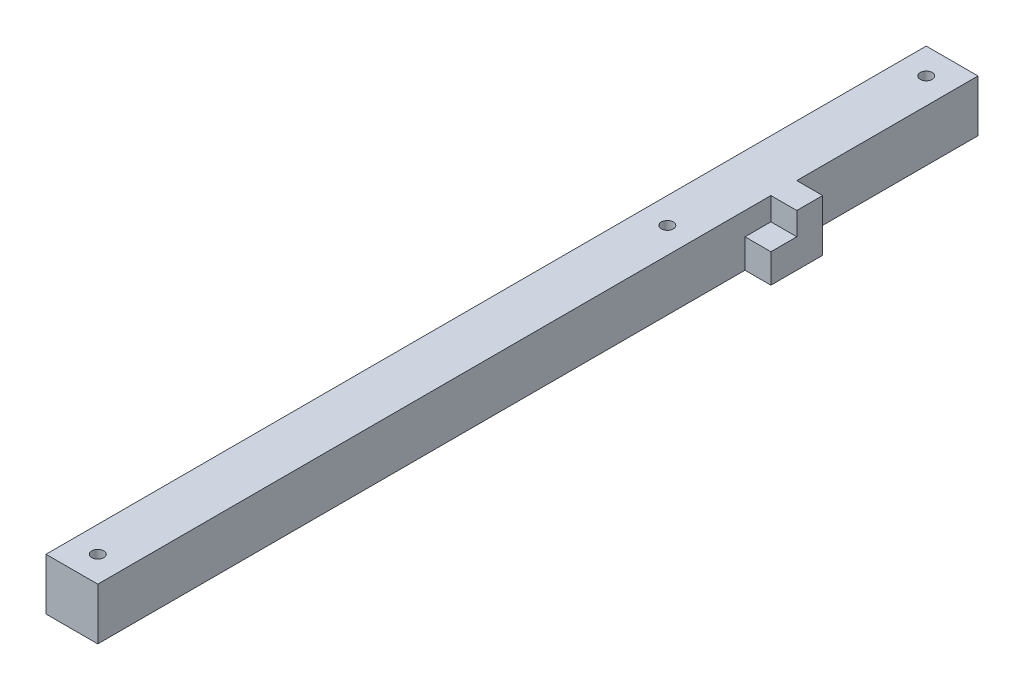
ISO-10303-21;
HEADER;
FILE_DESCRIPTION(('STEP AP214'),'2;1');
FILE_NAME('part.step','',(''),(''),'','','');
FILE_SCHEMA(('AUTOMOTIVE_DESIGN { 1 0 10303 214 1 1 1 1 }'));
ENDSEC;
DATA;
#1=APPLICATION_CONTEXT('core data for automotive mechanical design processes');
#2=APPLICATION_PROTOCOL_DEFINITION('international standard','automotive_design',2000,#1);
#3=PRODUCT_CONTEXT('',#1,'mechanical');
#4=PRODUCT('Part','Part','',(#3));
#5=PRODUCT_RELATED_PRODUCT_CATEGORY('part','',(#4));
#6=PRODUCT_DEFINITION_FORMATION('','',#4);
#7=PRODUCT_DEFINITION_CONTEXT('part definition',#1,'design');
#8=PRODUCT_DEFINITION('design','',#6,#7);
#9=PRODUCT_DEFINITION_SHAPE('','',#8);
#10=(LENGTH_UNIT() NAMED_UNIT(*) SI_UNIT(.MILLI.,.METRE.));
#11=(NAMED_UNIT(*) PLANE_ANGLE_UNIT() SI_UNIT($,.RADIAN.));
#12=(NAMED_UNIT(*) SI_UNIT($,.STERADIAN.) SOLID_ANGLE_UNIT());
#13=UNCERTAINTY_MEASURE_WITH_UNIT(LENGTH_MEASURE(1.E-05),#10,'distance_accuracy_value','');
#14=(GEOMETRIC_REPRESENTATION_CONTEXT(3) GLOBAL_UNCERTAINTY_ASSIGNED_CONTEXT((#13)) GLOBAL_UNIT_ASSIGNED_CONTEXT((#10,
#11,#12)) REPRESENTATION_CONTEXT('',''));
#15=CARTESIAN_POINT('',(0.,0.,0.));
#16=DIRECTION('',(0.,0.,1.));
#17=DIRECTION('',(1.,0.,0.));
#18=AXIS2_PLACEMENT_3D('',#15,#16,#17);
#19=CARTESIAN_POINT('',(0.,12.7,0.));
#20=DIRECTION('',(0.,-1.,0.));
#21=DIRECTION('',(0.,0.,-1.));
#22=AXIS2_PLACEMENT_3D('',#19,#20,#21);
#23=PLANE('',#22);
#24=CARTESIAN_POINT('',(-6.35,12.7,6.35));
#25=DIRECTION('',(0.,1.,0.));
#26=DIRECTION('',(0.,0.,1.));
#27=AXIS2_PLACEMENT_3D('',#24,#25,#26);
#28=CIRCLE('',#27,1.47319999999999);
#29=CARTESIAN_POINT('',(-6.35,12.7,7.82319999999999));
#30=VERTEX_POINT('',#29);
#31=EDGE_CURVE('E172',#30,#30,#28,.T.);
#32=ORIENTED_EDGE('',*,*,#31,.F.);
#33=EDGE_LOOP('',(#32));
#34=FACE_BOUND('',#33,.T.);
#35=CARTESIAN_POINT('',(-6.35,12.7,-133.35));
#36=DIRECTION('',(0.,1.,0.));
#37=DIRECTION('',(0.,0.,1.));
#38=AXIS2_PLACEMENT_3D('',#35,#36,#37);
#39=CIRCLE('',#38,1.47319999999999);
#40=CARTESIAN_POINT('',(-6.35,12.7,-131.8768));
#41=VERTEX_POINT('',#40);
#42=EDGE_CURVE('E166',#41,#41,#39,.T.);
#43=ORIENTED_EDGE('',*,*,#42,.F.);
#44=EDGE_LOOP('',(#43));
#45=FACE_BOUND('',#44,.T.);
#46=CARTESIAN_POINT('',(-6.35,12.7,-196.85));
#47=DIRECTION('',(0.,1.,0.));
#48=DIRECTION('',(0.,0.,1.));
#49=AXIS2_PLACEMENT_3D('',#46,#47,#48);
#50=CIRCLE('',#49,1.47319999999999);
#51=CARTESIAN_POINT('',(-6.35,12.7,-195.3768));
#52=VERTEX_POINT('',#51);
#53=EDGE_CURVE('E160',#52,#52,#50,.T.);
#54=ORIENTED_EDGE('',*,*,#53,.F.);
#55=EDGE_LOOP('',(#54));
#56=FACE_BOUND('',#55,.T.);
#57=DIRECTION('',(0.,0.,1.));
#58=VECTOR('',#57,1.);
#59=CARTESIAN_POINT('',(-12.7,12.7,12.7));
#60=LINE('',#59,#58);
#61=CARTESIAN_POINT('',(-12.7,12.7,-203.2));
#62=VERTEX_POINT('',#61);
#63=CARTESIAN_POINT('',(-12.7,12.7,12.7));
#64=VERTEX_POINT('',#63);
#65=EDGE_CURVE('E179',#62,#64,#60,.T.);
#66=ORIENTED_EDGE('',*,*,#65,.T.);
#67=DIRECTION('',(1.,0.,0.));
#68=VECTOR('',#67,1.);
#69=CARTESIAN_POINT('',(-12.7,12.7,12.7));
#70=LINE('',#69,#68);
#71=CARTESIAN_POINT('',(0.,12.7,12.7));
#72=VERTEX_POINT('',#71);
#73=EDGE_CURVE('E181',#64,#72,#70,.T.);
#74=ORIENTED_EDGE('',*,*,#73,.T.);
#75=DIRECTION('',(0.,0.,-1.));
#76=VECTOR('',#75,1.);
#77=CARTESIAN_POINT('',(0.,12.7,12.7));
#78=LINE('',#77,#76);
#79=CARTESIAN_POINT('',(0.,12.7,-152.4));
#80=VERTEX_POINT('',#79);
#81=EDGE_CURVE('E185',#72,#80,#78,.T.);
#82=ORIENTED_EDGE('',*,*,#81,.T.);
#83=DIRECTION('',(-1.,0.,0.));
#84=VECTOR('',#83,1.);
#85=CARTESIAN_POINT('',(6.35,12.7,-152.4));
#86=LINE('',#85,#84);
#87=CARTESIAN_POINT('',(6.35,12.7,-152.4));
#88=VERTEX_POINT('',#87);
#89=EDGE_CURVE('E151',#88,#80,#86,.T.);
#90=ORIENTED_EDGE('',*,*,#89,.F.);
#91=DIRECTION('',(0.,0.,-1.));
#92=VECTOR('',#91,1.);
#93=CARTESIAN_POINT('',(6.35,12.7,-152.4));
#94=LINE('',#93,#92);
#95=CARTESIAN_POINT('',(6.35,12.7,-158.75));
#96=VERTEX_POINT('',#95);
#97=EDGE_CURVE('E119',#88,#96,#94,.T.);
#98=ORIENTED_EDGE('',*,*,#97,.T.);
#99=DIRECTION('',(-1.,0.,0.));
#100=VECTOR('',#99,1.);
#101=CARTESIAN_POINT('',(6.35,12.7,-158.75));
#102=LINE('',#101,#100);
#103=CARTESIAN_POINT('',(0.,12.7,-158.75));
#104=VERTEX_POINT('',#103);
#105=EDGE_CURVE('E156',#96,#104,#102,.T.);
#106=ORIENTED_EDGE('',*,*,#105,.T.);
#107=CARTESIAN_POINT('',(0.,12.7,-203.2));
#108=VERTEX_POINT('',#107);
#109=EDGE_CURVE('E184',#104,#108,#78,.T.);
#110=ORIENTED_EDGE('',*,*,#109,.T.);
#111=DIRECTION('',(-1.,0.,0.));
#112=VECTOR('',#111,1.);
#113=CARTESIAN_POINT('',(-12.7,12.7,-203.2));
#114=LINE('',#113,#112);
#115=EDGE_CURVE('E188',#108,#62,#114,.T.);
#116=ORIENTED_EDGE('',*,*,#115,.T.);
#117=EDGE_LOOP('',(#66,#74,#82,#90,#98,#106,#110,#116));
#118=FACE_BOUND('',#117,.T.);
#119=ADVANCED_FACE('F33',(#34,#45,#56,#118),#23,.F.);
#120=CARTESIAN_POINT('',(0.,0.,0.));
#121=DIRECTION('',(0.,-1.,0.));
#122=DIRECTION('',(0.,0.,-1.));
#123=AXIS2_PLACEMENT_3D('',#120,#121,#122);
#124=PLANE('',#123);
#125=CARTESIAN_POINT('',(-6.35,0.,-196.85));
#126=DIRECTION('',(0.,1.,0.));
#127=DIRECTION('',(0.,0.,1.));
#128=AXIS2_PLACEMENT_3D('',#125,#126,#127);
#129=CIRCLE('',#128,1.4732);
#130=CARTESIAN_POINT('',(-6.35,0.,-195.3768));
#131=VERTEX_POINT('',#130);
#132=EDGE_CURVE('E163',#131,#131,#129,.T.);
#133=ORIENTED_EDGE('',*,*,#132,.T.);
#134=EDGE_LOOP('',(#133));
#135=FACE_BOUND('',#134,.T.);
#136=CARTESIAN_POINT('',(-6.35,0.,-133.35));
#137=DIRECTION('',(0.,1.,0.));
#138=DIRECTION('',(0.,0.,1.));
#139=AXIS2_PLACEMENT_3D('',#136,#137,#138);
#140=CIRCLE('',#139,1.4732);
#141=CARTESIAN_POINT('',(-6.35,0.,-131.8768));
#142=VERTEX_POINT('',#141);
#143=EDGE_CURVE('E169',#142,#142,#140,.T.);
#144=ORIENTED_EDGE('',*,*,#143,.T.);
#145=EDGE_LOOP('',(#144));
#146=FACE_BOUND('',#145,.T.);
#147=CARTESIAN_POINT('',(-6.35,0.,6.35));
#148=DIRECTION('',(0.,1.,0.));
#149=DIRECTION('',(0.,0.,1.));
#150=AXIS2_PLACEMENT_3D('',#147,#148,#149);
#151=CIRCLE('',#150,1.4732);
#152=CARTESIAN_POINT('',(-6.35,0.,7.8232));
#153=VERTEX_POINT('',#152);
#154=EDGE_CURVE('E175',#153,#153,#151,.T.);
#155=ORIENTED_EDGE('',*,*,#154,.T.);
#156=EDGE_LOOP('',(#155));
#157=FACE_BOUND('',#156,.T.);
#158=DIRECTION('',(1.,0.,0.));
#159=VECTOR('',#158,1.);
#160=CARTESIAN_POINT('',(-12.7,0.,12.7));
#161=LINE('',#160,#159);
#162=CARTESIAN_POINT('',(-12.7,0.,12.7));
#163=VERTEX_POINT('',#162);
#164=CARTESIAN_POINT('',(0.,0.,12.7));
#165=VERTEX_POINT('',#164);
#166=EDGE_CURVE('E192',#163,#165,#161,.T.);
#167=ORIENTED_EDGE('',*,*,#166,.F.);
#168=DIRECTION('',(0.,0.,1.));
#169=VECTOR('',#168,1.);
#170=CARTESIAN_POINT('',(-12.7,0.,12.7));
#171=LINE('',#170,#169);
#172=CARTESIAN_POINT('',(-12.7,0.,-203.2));
#173=VERTEX_POINT('',#172);
#174=EDGE_CURVE('E178',#173,#163,#171,.T.);
#175=ORIENTED_EDGE('',*,*,#174,.F.);
#176=DIRECTION('',(-1.,0.,0.));
#177=VECTOR('',#176,1.);
#178=CARTESIAN_POINT('',(-12.7,0.,-203.2));
#179=LINE('',#178,#177);
#180=CARTESIAN_POINT('',(0.,0.,-203.2));
#181=VERTEX_POINT('',#180);
#182=EDGE_CURVE('E182',#181,#173,#179,.T.);
#183=ORIENTED_EDGE('',*,*,#182,.F.);
#184=DIRECTION('',(0.,0.,-1.));
#185=VECTOR('',#184,1.);
#186=CARTESIAN_POINT('',(0.,0.,12.7));
#187=LINE('',#186,#185);
#188=CARTESIAN_POINT('',(0.,0.,-158.75));
#189=VERTEX_POINT('',#188);
#190=EDGE_CURVE('E194',#189,#181,#187,.T.);
#191=ORIENTED_EDGE('',*,*,#190,.F.);
#192=DIRECTION('',(-1.,0.,0.));
#193=VECTOR('',#192,1.);
#194=CARTESIAN_POINT('',(6.35,0.,-158.75));
#195=LINE('',#194,#193);
#196=CARTESIAN_POINT('',(6.35,0.,-158.75));
#197=VERTEX_POINT('',#196);
#198=EDGE_CURVE('E158',#197,#189,#195,.T.);
#199=ORIENTED_EDGE('',*,*,#198,.F.);
#200=DIRECTION('',(0.,0.,1.));
#201=VECTOR('',#200,1.);
#202=CARTESIAN_POINT('',(6.35,0.,-152.4));
#203=LINE('',#202,#201);
#204=CARTESIAN_POINT('',(6.35,0.,-146.05));
#205=VERTEX_POINT('',#204);
#206=EDGE_CURVE('E123',#197,#205,#203,.T.);
#207=ORIENTED_EDGE('',*,*,#206,.T.);
#208=DIRECTION('',(-1.,0.,0.));
#209=VECTOR('',#208,1.);
#210=CARTESIAN_POINT('',(6.35,0.,-146.05));
#211=LINE('',#210,#209);
#212=CARTESIAN_POINT('',(0.,0.,-146.05));
#213=VERTEX_POINT('',#212);
#214=EDGE_CURVE('E138',#205,#213,#211,.T.);
#215=ORIENTED_EDGE('',*,*,#214,.T.);
#216=EDGE_CURVE('E53',#165,#213,#187,.T.);
#217=ORIENTED_EDGE('',*,*,#216,.F.);
#218=EDGE_LOOP('',(#167,#175,#183,#191,#199,#207,#215,#217));
#219=FACE_BOUND('',#218,.T.);
#220=ADVANCED_FACE('F208',(#135,#146,#157,#219),#124,.T.);
#221=CARTESIAN_POINT('',(0.,12.7,12.7));
#222=DIRECTION('',(-1.,0.,0.));
#223=DIRECTION('',(0.,0.,1.));
#224=AXIS2_PLACEMENT_3D('',#221,#222,#223);
#225=PLANE('',#224);
#226=DIRECTION('',(0.,1.,0.));
#227=VECTOR('',#226,1.);
#228=CARTESIAN_POINT('',(0.,0.,-146.05));
#229=LINE('',#228,#227);
#230=CARTESIAN_POINT('',(0.,7.112,-146.05));
#231=VERTEX_POINT('',#230);
#232=EDGE_CURVE('E48',#213,#231,#229,.T.);
#233=ORIENTED_EDGE('',*,*,#232,.T.);
#234=DIRECTION('',(0.,0.,-1.));
#235=VECTOR('',#234,1.);
#236=CARTESIAN_POINT('',(0.,7.112,-152.4));
#237=LINE('',#236,#235);
#238=CARTESIAN_POINT('',(0.,7.112,-152.4));
#239=VERTEX_POINT('',#238);
#240=EDGE_CURVE('E140',#231,#239,#237,.T.);
#241=ORIENTED_EDGE('',*,*,#240,.T.);
#242=DIRECTION('',(0.,1.,0.));
#243=VECTOR('',#242,1.);
#244=CARTESIAN_POINT('',(0.,0.,-152.4));
#245=LINE('',#244,#243);
#246=EDGE_CURVE('E130',#239,#80,#245,.T.);
#247=ORIENTED_EDGE('',*,*,#246,.T.);
#248=ORIENTED_EDGE('',*,*,#81,.F.);
#249=DIRECTION('',(0.,-1.,0.));
#250=VECTOR('',#249,1.);
#251=CARTESIAN_POINT('',(0.,12.7,12.7));
#252=LINE('',#251,#250);
#253=EDGE_CURVE('E41',#72,#165,#252,.T.);
#254=ORIENTED_EDGE('',*,*,#253,.T.);
#255=ORIENTED_EDGE('',*,*,#216,.T.);
#256=EDGE_LOOP('',(#233,#241,#247,#248,#254,#255));
#257=FACE_BOUND('',#256,.T.);
#258=ADVANCED_FACE('F203',(#257),#225,.F.);
#259=CARTESIAN_POINT('',(-12.7,12.7,12.7));
#260=DIRECTION('',(1.,0.,0.));
#261=DIRECTION('',(0.,0.,-1.));
#262=AXIS2_PLACEMENT_3D('',#259,#260,#261);
#263=PLANE('',#262);
#264=DIRECTION('',(0.,-1.,0.));
#265=VECTOR('',#264,1.);
#266=CARTESIAN_POINT('',(-12.7,12.7,12.7));
#267=LINE('',#266,#265);
#268=EDGE_CURVE('E11',#64,#163,#267,.T.);
#269=ORIENTED_EDGE('',*,*,#268,.F.);
#270=ORIENTED_EDGE('',*,*,#65,.F.);
#271=DIRECTION('',(0.,-1.,0.));
#272=VECTOR('',#271,1.);
#273=CARTESIAN_POINT('',(-12.7,12.7,-203.2));
#274=LINE('',#273,#272);
#275=EDGE_CURVE('E190',#62,#173,#274,.T.);
#276=ORIENTED_EDGE('',*,*,#275,.T.);
#277=ORIENTED_EDGE('',*,*,#174,.T.);
#278=EDGE_LOOP('',(#269,#270,#276,#277));
#279=FACE_BOUND('',#278,.T.);
#280=ADVANCED_FACE('F35',(#279),#263,.F.);
#281=CARTESIAN_POINT('',(-12.7,12.7,12.7));
#282=DIRECTION('',(0.,0.,-1.));
#283=DIRECTION('',(-1.,0.,0.));
#284=AXIS2_PLACEMENT_3D('',#281,#282,#283);
#285=PLANE('',#284);
#286=ORIENTED_EDGE('',*,*,#166,.T.);
#287=ORIENTED_EDGE('',*,*,#253,.F.);
#288=ORIENTED_EDGE('',*,*,#73,.F.);
#289=ORIENTED_EDGE('',*,*,#268,.T.);
#290=EDGE_LOOP('',(#286,#287,#288,#289));
#291=FACE_BOUND('',#290,.T.);
#292=ADVANCED_FACE('F217',(#291),#285,.F.);
#293=ORIENTED_EDGE('',*,*,#109,.F.);
#294=DIRECTION('',(0.,-1.,0.));
#295=VECTOR('',#294,1.);
#296=CARTESIAN_POINT('',(0.,0.,-158.75));
#297=LINE('',#296,#295);
#298=EDGE_CURVE('E124',#104,#189,#297,.T.);
#299=ORIENTED_EDGE('',*,*,#298,.T.);
#300=ORIENTED_EDGE('',*,*,#190,.T.);
#301=DIRECTION('',(0.,-1.,0.));
#302=VECTOR('',#301,1.);
#303=CARTESIAN_POINT('',(0.,12.7,-203.2));
#304=LINE('',#303,#302);
#305=EDGE_CURVE('E199',#108,#181,#304,.T.);
#306=ORIENTED_EDGE('',*,*,#305,.F.);
#307=EDGE_LOOP('',(#293,#299,#300,#306));
#308=FACE_BOUND('',#307,.T.);
#309=ADVANCED_FACE('F228',(#308),#225,.F.);
#310=CARTESIAN_POINT('',(-12.7,12.7,-203.2));
#311=DIRECTION('',(0.,0.,1.));
#312=DIRECTION('',(1.,0.,0.));
#313=AXIS2_PLACEMENT_3D('',#310,#311,#312);
#314=PLANE('',#313);
#315=ORIENTED_EDGE('',*,*,#182,.T.);
#316=ORIENTED_EDGE('',*,*,#275,.F.);
#317=ORIENTED_EDGE('',*,*,#115,.F.);
#318=ORIENTED_EDGE('',*,*,#305,.T.);
#319=EDGE_LOOP('',(#315,#316,#317,#318));
#320=FACE_BOUND('',#319,.T.);
#321=ADVANCED_FACE('F223',(#320),#314,.F.);
#322=CARTESIAN_POINT('',(-6.35,12.7,6.35));
#323=DIRECTION('',(0.,1.,0.));
#324=DIRECTION('',(0.,0.,1.));
#325=AXIS2_PLACEMENT_3D('',#322,#323,#324);
#326=CYLINDRICAL_SURFACE('',#325,1.47319999999999);
#327=ORIENTED_EDGE('',*,*,#154,.F.);
#328=EDGE_LOOP('',(#327));
#329=FACE_BOUND('',#328,.T.);
#330=ORIENTED_EDGE('',*,*,#31,.T.);
#331=EDGE_LOOP('',(#330));
#332=FACE_BOUND('',#331,.T.);
#333=ADVANCED_FACE('F252',(#329,#332),#326,.F.);
#334=CARTESIAN_POINT('',(-6.35,12.7,-133.35));
#335=DIRECTION('',(0.,1.,0.));
#336=DIRECTION('',(0.,0.,1.));
#337=AXIS2_PLACEMENT_3D('',#334,#335,#336);
#338=CYLINDRICAL_SURFACE('',#337,1.47319999999999);
#339=ORIENTED_EDGE('',*,*,#143,.F.);
#340=EDGE_LOOP('',(#339));
#341=FACE_BOUND('',#340,.T.);
#342=ORIENTED_EDGE('',*,*,#42,.T.);
#343=EDGE_LOOP('',(#342));
#344=FACE_BOUND('',#343,.T.);
#345=ADVANCED_FACE('F362',(#341,#344),#338,.F.);
#346=CARTESIAN_POINT('',(-6.35,12.7,-196.85));
#347=DIRECTION('',(0.,1.,0.));
#348=DIRECTION('',(0.,0.,1.));
#349=AXIS2_PLACEMENT_3D('',#346,#347,#348);
#350=CYLINDRICAL_SURFACE('',#349,1.47319999999999);
#351=ORIENTED_EDGE('',*,*,#132,.F.);
#352=EDGE_LOOP('',(#351));
#353=FACE_BOUND('',#352,.T.);
#354=ORIENTED_EDGE('',*,*,#53,.T.);
#355=EDGE_LOOP('',(#354));
#356=FACE_BOUND('',#355,.T.);
#357=ADVANCED_FACE('F239',(#353,#356),#350,.F.);
#358=CARTESIAN_POINT('',(6.35,0.,-152.4));
#359=DIRECTION('',(0.,0.,1.));
#360=DIRECTION('',(1.,0.,0.));
#361=AXIS2_PLACEMENT_3D('',#358,#359,#360);
#362=PLANE('',#361);
#363=DIRECTION('',(-1.,0.,0.));
#364=VECTOR('',#363,1.);
#365=CARTESIAN_POINT('',(6.35,7.112,-152.4));
#366=LINE('',#365,#364);
#367=CARTESIAN_POINT('',(6.35,7.112,-152.4));
#368=VERTEX_POINT('',#367);
#369=EDGE_CURVE('E128',#368,#239,#366,.T.);
#370=ORIENTED_EDGE('',*,*,#369,.F.);
#371=DIRECTION('',(0.,1.,0.));
#372=VECTOR('',#371,1.);
#373=CARTESIAN_POINT('',(6.35,0.,-152.4));
#374=LINE('',#373,#372);
#375=EDGE_CURVE('E110',#368,#88,#374,.T.);
#376=ORIENTED_EDGE('',*,*,#375,.T.);
#377=ORIENTED_EDGE('',*,*,#89,.T.);
#378=ORIENTED_EDGE('',*,*,#246,.F.);
#379=EDGE_LOOP('',(#370,#376,#377,#378));
#380=FACE_BOUND('',#379,.T.);
#381=ADVANCED_FACE('F129',(#380),#362,.T.);
#382=CARTESIAN_POINT('',(6.35,0.,-158.75));
#383=DIRECTION('',(0.,0.,-1.));
#384=DIRECTION('',(-1.,0.,0.));
#385=AXIS2_PLACEMENT_3D('',#382,#383,#384);
#386=PLANE('',#385);
#387=ORIENTED_EDGE('',*,*,#298,.F.);
#388=ORIENTED_EDGE('',*,*,#105,.F.);
#389=DIRECTION('',(0.,-1.,0.));
#390=VECTOR('',#389,1.);
#391=CARTESIAN_POINT('',(6.35,0.,-158.75));
#392=LINE('',#391,#390);
#393=EDGE_CURVE('E147',#96,#197,#392,.T.);
#394=ORIENTED_EDGE('',*,*,#393,.T.);
#395=ORIENTED_EDGE('',*,*,#198,.T.);
#396=EDGE_LOOP('',(#387,#388,#394,#395));
#397=FACE_BOUND('',#396,.T.);
#398=ADVANCED_FACE('F231',(#397),#386,.T.);
#399=CARTESIAN_POINT('',(6.35,0.,0.));
#400=DIRECTION('',(1.,0.,0.));
#401=DIRECTION('',(0.,0.,1.));
#402=AXIS2_PLACEMENT_3D('',#399,#400,#401);
#403=PLANE('',#402);
#404=ORIENTED_EDGE('',*,*,#375,.F.);
#405=DIRECTION('',(0.,0.,-1.));
#406=VECTOR('',#405,1.);
#407=CARTESIAN_POINT('',(6.35,7.112,-152.4));
#408=LINE('',#407,#406);
#409=CARTESIAN_POINT('',(6.35,7.112,-146.05));
#410=VERTEX_POINT('',#409);
#411=EDGE_CURVE('E115',#410,#368,#408,.T.);
#412=ORIENTED_EDGE('',*,*,#411,.F.);
#413=DIRECTION('',(0.,1.,0.));
#414=VECTOR('',#413,1.);
#415=CARTESIAN_POINT('',(6.35,0.,-146.05));
#416=LINE('',#415,#414);
#417=EDGE_CURVE('E136',#205,#410,#416,.T.);
#418=ORIENTED_EDGE('',*,*,#417,.F.);
#419=ORIENTED_EDGE('',*,*,#206,.F.);
#420=ORIENTED_EDGE('',*,*,#393,.F.);
#421=ORIENTED_EDGE('',*,*,#97,.F.);
#422=EDGE_LOOP('',(#404,#412,#418,#419,#420,#421));
#423=FACE_BOUND('',#422,.T.);
#424=ADVANCED_FACE('F112',(#423),#403,.T.);
#425=CARTESIAN_POINT('',(6.35,7.112,-152.4));
#426=DIRECTION('',(0.,1.,0.));
#427=DIRECTION('',(0.,0.,1.));
#428=AXIS2_PLACEMENT_3D('',#425,#426,#427);
#429=PLANE('',#428);
#430=ORIENTED_EDGE('',*,*,#240,.F.);
#431=DIRECTION('',(-1.,0.,0.));
#432=VECTOR('',#431,1.);
#433=CARTESIAN_POINT('',(6.35,7.112,-146.05));
#434=LINE('',#433,#432);
#435=EDGE_CURVE('E133',#410,#231,#434,.T.);
#436=ORIENTED_EDGE('',*,*,#435,.F.);
#437=ORIENTED_EDGE('',*,*,#411,.T.);
#438=ORIENTED_EDGE('',*,*,#369,.T.);
#439=EDGE_LOOP('',(#430,#436,#437,#438));
#440=FACE_BOUND('',#439,.T.);
#441=ADVANCED_FACE('F135',(#440),#429,.T.);
#442=CARTESIAN_POINT('',(6.35,0.,-146.05));
#443=DIRECTION('',(0.,0.,1.));
#444=DIRECTION('',(1.,0.,0.));
#445=AXIS2_PLACEMENT_3D('',#442,#443,#444);
#446=PLANE('',#445);
#447=ORIENTED_EDGE('',*,*,#232,.F.);
#448=ORIENTED_EDGE('',*,*,#214,.F.);
#449=ORIENTED_EDGE('',*,*,#417,.T.);
#450=ORIENTED_EDGE('',*,*,#435,.T.);
#451=EDGE_LOOP('',(#447,#448,#449,#450));
#452=FACE_BOUND('',#451,.T.);
#453=ADVANCED_FACE('F213',(#452),#446,.T.);
#454=CLOSED_SHELL('',(#119,#220,#258,#280,#292,#309,#321,#333,#345,#357,#381,#398,#424,#441,#453));
#455=MANIFOLD_SOLID_BREP('B2',#454);
#456=ADVANCED_BREP_SHAPE_REPRESENTATION('',(#18,#455),#14);
#457=SHAPE_DEFINITION_REPRESENTATION(#9,#456);
ENDSEC;
END-ISO-10303-21;
